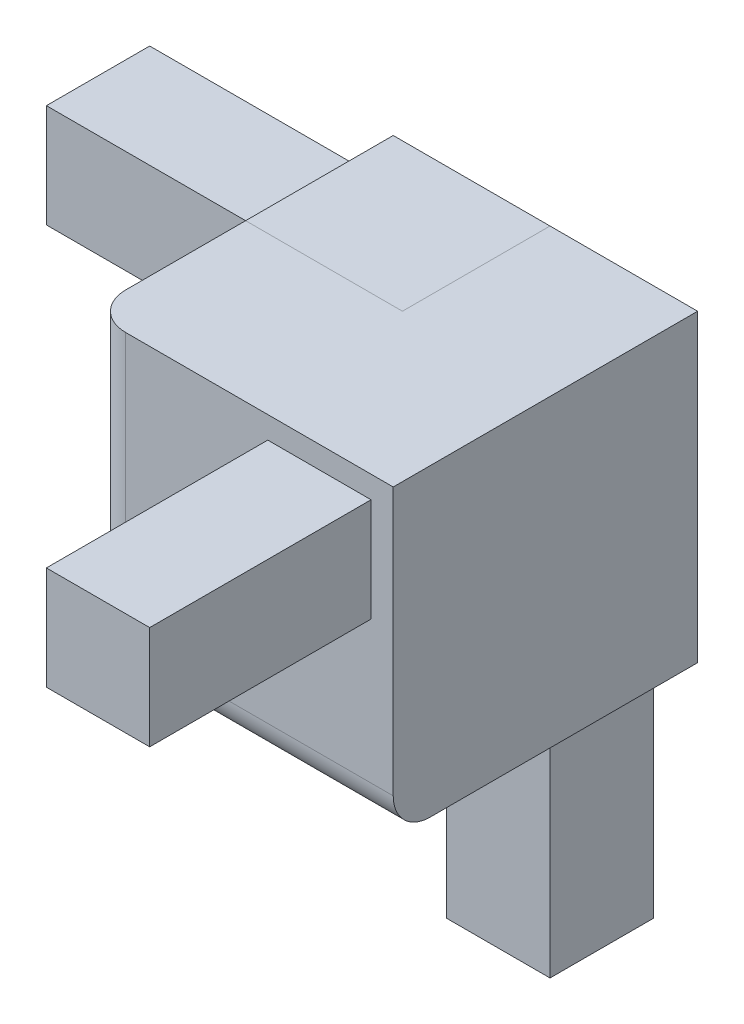
ISO-10303-21;
HEADER;
FILE_DESCRIPTION(('STEP AP214'),'2;1');
FILE_NAME('part.step','',(''),(''),'','','');
FILE_SCHEMA(('AUTOMOTIVE_DESIGN { 1 0 10303 214 1 1 1 1 }'));
ENDSEC;
DATA;
#1=APPLICATION_CONTEXT('core data for automotive mechanical design processes');
#2=APPLICATION_PROTOCOL_DEFINITION('international standard','automotive_design',2000,#1);
#3=PRODUCT_CONTEXT('',#1,'mechanical');
#4=PRODUCT('Part','Part','',(#3));
#5=PRODUCT_RELATED_PRODUCT_CATEGORY('part','',(#4));
#6=PRODUCT_DEFINITION_FORMATION('','',#4);
#7=PRODUCT_DEFINITION_CONTEXT('part definition',#1,'design');
#8=PRODUCT_DEFINITION('design','',#6,#7);
#9=PRODUCT_DEFINITION_SHAPE('','',#8);
#10=(LENGTH_UNIT() NAMED_UNIT(*) SI_UNIT(.MILLI.,.METRE.));
#11=(NAMED_UNIT(*) PLANE_ANGLE_UNIT() SI_UNIT($,.RADIAN.));
#12=(NAMED_UNIT(*) SI_UNIT($,.STERADIAN.) SOLID_ANGLE_UNIT());
#13=UNCERTAINTY_MEASURE_WITH_UNIT(LENGTH_MEASURE(1.E-05),#10,'distance_accuracy_value','');
#14=(GEOMETRIC_REPRESENTATION_CONTEXT(3) GLOBAL_UNCERTAINTY_ASSIGNED_CONTEXT((#13)) GLOBAL_UNIT_ASSIGNED_CONTEXT((#10,
#11,#12)) REPRESENTATION_CONTEXT('',''));
#15=CARTESIAN_POINT('',(0.,0.,0.));
#16=DIRECTION('',(0.,0.,1.));
#17=DIRECTION('',(1.,0.,0.));
#18=AXIS2_PLACEMENT_3D('',#15,#16,#17);
#19=CARTESIAN_POINT('',(19.2615788817127,23.0541991604437,-26.8947253479235));
#20=DIRECTION('',(-1.,0.,0.));
#21=DIRECTION('',(0.,-1.,0.));
#22=AXIS2_PLACEMENT_3D('',#19,#20,#21);
#23=PLANE('',#22);
#24=DIRECTION('',(0.,0.,1.));
#25=VECTOR('',#24,1.);
#26=CARTESIAN_POINT('',(19.2615788817127,35.0541991604437,-26.8947253479235));
#27=LINE('',#26,#25);
#28=CARTESIAN_POINT('',(19.2615788817127,35.0541991604437,-26.8947253479235));
#29=VERTEX_POINT('',#28);
#30=CARTESIAN_POINT('',(19.2615788817127,35.0541991604437,-21.2947253479234));
#31=VERTEX_POINT('',#30);
#32=EDGE_CURVE('E207',#29,#31,#27,.T.);
#33=ORIENTED_EDGE('',*,*,#32,.F.);
#34=DIRECTION('',(0.,1.,0.));
#35=VECTOR('',#34,1.);
#36=CARTESIAN_POINT('',(19.2615788817127,23.0541991604437,-26.8947253479235));
#37=LINE('',#36,#35);
#38=CARTESIAN_POINT('',(19.2615788817127,23.0541991604437,-26.8947253479235));
#39=VERTEX_POINT('',#38);
#40=EDGE_CURVE('E272',#39,#29,#37,.T.);
#41=ORIENTED_EDGE('',*,*,#40,.F.);
#42=DIRECTION('',(0.,0.,1.));
#43=VECTOR('',#42,1.);
#44=CARTESIAN_POINT('',(19.2615788817127,23.0541991604437,-26.8947253479235));
#45=LINE('',#44,#43);
#46=CARTESIAN_POINT('',(19.2615788817127,23.0541991604437,-21.2947253479234));
#47=VERTEX_POINT('',#46);
#48=EDGE_CURVE('E663',#39,#47,#45,.T.);
#49=ORIENTED_EDGE('',*,*,#48,.T.);
#50=DIRECTION('',(0.,1.,0.));
#51=VECTOR('',#50,1.);
#52=CARTESIAN_POINT('',(19.2615788817127,23.0541991604437,-21.2947253479234));
#53=LINE('',#52,#51);
#54=EDGE_CURVE('E676',#47,#31,#53,.T.);
#55=ORIENTED_EDGE('',*,*,#54,.T.);
#56=EDGE_LOOP('',(#33,#41,#49,#55));
#57=FACE_BOUND('',#56,.T.);
#58=ADVANCED_FACE('F39',(#57),#23,.T.);
#59=CARTESIAN_POINT('',(24.8615788817128,23.0541991604437,-26.8947253479235));
#60=DIRECTION('',(0.,0.,-1.));
#61=DIRECTION('',(0.,1.,0.));
#62=AXIS2_PLACEMENT_3D('',#59,#60,#61);
#63=PLANE('',#62);
#64=DIRECTION('',(-1.,0.,0.));
#65=VECTOR('',#64,1.);
#66=CARTESIAN_POINT('',(24.8615788817128,35.0541991604437,-26.8947253479235));
#67=LINE('',#66,#65);
#68=CARTESIAN_POINT('',(24.8615788817128,35.0541991604437,-26.8947253479235));
#69=VERTEX_POINT('',#68);
#70=EDGE_CURVE('E667',#69,#29,#67,.T.);
#71=ORIENTED_EDGE('',*,*,#70,.F.);
#72=DIRECTION('',(0.,1.,0.));
#73=VECTOR('',#72,1.);
#74=CARTESIAN_POINT('',(24.8615788817128,23.0541991604437,-26.8947253479235));
#75=LINE('',#74,#73);
#76=CARTESIAN_POINT('',(24.8615788817128,23.0541991604437,-26.8947253479235));
#77=VERTEX_POINT('',#76);
#78=EDGE_CURVE('E689',#77,#69,#75,.T.);
#79=ORIENTED_EDGE('',*,*,#78,.F.);
#80=DIRECTION('',(-1.,0.,0.));
#81=VECTOR('',#80,1.);
#82=CARTESIAN_POINT('',(24.8615788817128,23.0541991604437,-26.8947253479235));
#83=LINE('',#82,#81);
#84=EDGE_CURVE('E673',#77,#39,#83,.T.);
#85=ORIENTED_EDGE('',*,*,#84,.T.);
#86=ORIENTED_EDGE('',*,*,#40,.T.);
#87=EDGE_LOOP('',(#71,#79,#85,#86));
#88=FACE_BOUND('',#87,.T.);
#89=ADVANCED_FACE('F383',(#88),#63,.T.);
#90=CARTESIAN_POINT('',(24.8615788817128,23.0541991604437,-21.2947253479234));
#91=DIRECTION('',(1.,0.,0.));
#92=DIRECTION('',(0.,0.,-1.));
#93=AXIS2_PLACEMENT_3D('',#90,#91,#92);
#94=PLANE('',#93);
#95=DIRECTION('',(0.,0.,-1.));
#96=VECTOR('',#95,1.);
#97=CARTESIAN_POINT('',(24.8615788817128,35.0541991604437,-21.2947253479234));
#98=LINE('',#97,#96);
#99=CARTESIAN_POINT('',(24.8615788817128,35.0541991604437,-21.2947253479234));
#100=VERTEX_POINT('',#99);
#101=EDGE_CURVE('E682',#100,#69,#98,.T.);
#102=ORIENTED_EDGE('',*,*,#101,.F.);
#103=DIRECTION('',(0.,1.,0.));
#104=VECTOR('',#103,1.);
#105=CARTESIAN_POINT('',(24.8615788817128,23.0541991604437,-21.2947253479234));
#106=LINE('',#105,#104);
#107=CARTESIAN_POINT('',(24.8615788817128,23.0541991604437,-21.2947253479234));
#108=VERTEX_POINT('',#107);
#109=EDGE_CURVE('E691',#108,#100,#106,.T.);
#110=ORIENTED_EDGE('',*,*,#109,.F.);
#111=DIRECTION('',(0.,0.,-1.));
#112=VECTOR('',#111,1.);
#113=CARTESIAN_POINT('',(24.8615788817128,23.0541991604437,-21.2947253479234));
#114=LINE('',#113,#112);
#115=EDGE_CURVE('E670',#108,#77,#114,.T.);
#116=ORIENTED_EDGE('',*,*,#115,.T.);
#117=ORIENTED_EDGE('',*,*,#78,.T.);
#118=EDGE_LOOP('',(#102,#110,#116,#117));
#119=FACE_BOUND('',#118,.T.);
#120=ADVANCED_FACE('F386',(#119),#94,.T.);
#121=CARTESIAN_POINT('',(19.2615788817127,23.0541991604437,-21.2947253479234));
#122=DIRECTION('',(0.,0.,1.));
#123=DIRECTION('',(0.,-1.,0.));
#124=AXIS2_PLACEMENT_3D('',#121,#122,#123);
#125=PLANE('',#124);
#126=DIRECTION('',(1.,0.,0.));
#127=VECTOR('',#126,1.);
#128=CARTESIAN_POINT('',(19.2615788817127,35.0541991604437,-21.2947253479234));
#129=LINE('',#128,#127);
#130=EDGE_CURVE('E679',#31,#100,#129,.T.);
#131=ORIENTED_EDGE('',*,*,#130,.F.);
#132=ORIENTED_EDGE('',*,*,#54,.F.);
#133=DIRECTION('',(1.,0.,0.));
#134=VECTOR('',#133,1.);
#135=CARTESIAN_POINT('',(19.2615788817127,23.0541991604437,-21.2947253479234));
#136=LINE('',#135,#134);
#137=EDGE_CURVE('E666',#47,#108,#136,.T.);
#138=ORIENTED_EDGE('',*,*,#137,.T.);
#139=ORIENTED_EDGE('',*,*,#109,.T.);
#140=EDGE_LOOP('',(#131,#132,#138,#139));
#141=FACE_BOUND('',#140,.T.);
#142=ADVANCED_FACE('F381',(#141),#125,.T.);
#143=CARTESIAN_POINT('',(0.,23.0541991604437,0.));
#144=DIRECTION('',(0.,1.,0.));
#145=DIRECTION('',(0.,0.,1.));
#146=AXIS2_PLACEMENT_3D('',#143,#144,#145);
#147=PLANE('',#146);
#148=ORIENTED_EDGE('',*,*,#48,.F.);
#149=ORIENTED_EDGE('',*,*,#84,.F.);
#150=ORIENTED_EDGE('',*,*,#115,.F.);
#151=ORIENTED_EDGE('',*,*,#137,.F.);
#152=EDGE_LOOP('',(#148,#149,#150,#151));
#153=FACE_BOUND('',#152,.T.);
#154=ADVANCED_FACE('F372',(#153),#147,.F.);
#155=CARTESIAN_POINT('',(0.,35.0541991604437,0.));
#156=DIRECTION('',(0.,-1.,0.));
#157=DIRECTION('',(0.,0.,-1.));
#158=AXIS2_PLACEMENT_3D('',#155,#156,#157);
#159=PLANE('',#158);
#160=DIRECTION('',(1.,0.,0.));
#161=VECTOR('',#160,1.);
#162=CARTESIAN_POINT('',(9.56157888171276,35.0541991604437,-13.5947253479234));
#163=LINE('',#162,#161);
#164=CARTESIAN_POINT('',(26.0615788817128,35.0541991604437,-13.5947253479234));
#165=VERTEX_POINT('',#164);
#166=CARTESIAN_POINT('',(11.5615788817127,35.0541991604437,-13.5947253479234));
#167=VERTEX_POINT('',#166);
#168=EDGE_CURVE('E56',#165,#167,#163,.F.);
#169=ORIENTED_EDGE('',*,*,#168,.T.);
#170=DIRECTION('',(0.,0.,1.));
#171=VECTOR('',#170,1.);
#172=CARTESIAN_POINT('',(11.5615788817127,35.0541991604437,0.));
#173=LINE('',#172,#171);
#174=CARTESIAN_POINT('',(11.5615788817127,35.0541991604437,-28.0947379627985));
#175=VERTEX_POINT('',#174);
#176=EDGE_CURVE('E60',#167,#175,#173,.F.);
#177=ORIENTED_EDGE('',*,*,#176,.T.);
#178=DIRECTION('',(-1.,0.,0.));
#179=VECTOR('',#178,1.);
#180=CARTESIAN_POINT('',(26.0615788817128,35.0541991604437,-28.0947379627985));
#181=LINE('',#180,#179);
#182=CARTESIAN_POINT('',(18.0615788817128,35.0541991604437,-28.0947379572807));
#183=VERTEX_POINT('',#182);
#184=EDGE_CURVE('E217',#183,#175,#181,.T.);
#185=ORIENTED_EDGE('',*,*,#184,.F.);
#186=DIRECTION('',(-1.,0.,0.));
#187=VECTOR('',#186,1.);
#188=CARTESIAN_POINT('',(26.0615788817128,35.0541991604437,-28.0947379572807));
#189=LINE('',#188,#187);
#190=CARTESIAN_POINT('',(26.0615788817128,35.0541991604437,-28.0947379572807));
#191=VERTEX_POINT('',#190);
#192=EDGE_CURVE('E414',#191,#183,#189,.T.);
#193=ORIENTED_EDGE('',*,*,#192,.F.);
#194=DIRECTION('',(0.,0.,-1.));
#195=VECTOR('',#194,1.);
#196=CARTESIAN_POINT('',(26.0615788817128,35.0541991604437,-28.0947379572807));
#197=LINE('',#196,#195);
#198=EDGE_CURVE('E335',#165,#191,#197,.T.);
#199=ORIENTED_EDGE('',*,*,#198,.F.);
#200=EDGE_LOOP('',(#169,#177,#185,#193,#199));
#201=FACE_BOUND('',#200,.T.);
#202=ORIENTED_EDGE('',*,*,#70,.T.);
#203=ORIENTED_EDGE('',*,*,#32,.T.);
#204=ORIENTED_EDGE('',*,*,#130,.T.);
#205=ORIENTED_EDGE('',*,*,#101,.T.);
#206=EDGE_LOOP('',(#202,#203,#204,#205));
#207=FACE_BOUND('',#206,.T.);
#208=ADVANCED_FACE('F369',(#201,#207),#159,.T.);
#209=CARTESIAN_POINT('',(26.0615788817128,62.8679076594284,-28.0947379572807));
#210=DIRECTION('',(0.,0.,1.));
#211=DIRECTION('',(1.,0.,0.));
#212=AXIS2_PLACEMENT_3D('',#209,#210,#211);
#213=PLANE('',#212);
#214=DIRECTION('',(0.,-0.999999999999708,-7.64537882137411E-07));
#215=VECTOR('',#214,1.);
#216=CARTESIAN_POINT('',(18.0615788817128,62.8679076594122,-28.0947166981647));
#217=LINE('',#216,#215);
#218=CARTESIAN_POINT('',(18.0615788817128,35.0614163657298,-28.0947379572807));
#219=VERTEX_POINT('',#218);
#220=EDGE_CURVE('E214',#219,#183,#217,.T.);
#221=ORIENTED_EDGE('',*,*,#220,.F.);
#222=DIRECTION('',(0.,-1.,0.));
#223=VECTOR('',#222,1.);
#224=CARTESIAN_POINT('',(18.0615788817128,62.8679076594284,-28.0947379572807));
#225=LINE('',#224,#223);
#226=CARTESIAN_POINT('',(18.0615788817128,43.5542052767421,-28.0947314642219));
#227=VERTEX_POINT('',#226);
#228=EDGE_CURVE('E415',#227,#219,#225,.T.);
#229=ORIENTED_EDGE('',*,*,#228,.F.);
#230=CARTESIAN_POINT('',(18.0615788817128,51.554199160434,-28.0947253479235));
#231=DIRECTION('',(0.,-0.999999999999708,-7.64537882137861E-07));
#232=VECTOR('',#231,1.);
#233=LINE('',#230,#232);
#234=CARTESIAN_POINT('',(18.0615788817128,51.5541991604437,-28.0947316526021));
#235=VERTEX_POINT('',#234);
#236=EDGE_CURVE('E330',#235,#227,#233,.T.);
#237=ORIENTED_EDGE('',*,*,#236,.F.);
#238=DIRECTION('',(1.,0.,0.));
#239=VECTOR('',#238,1.);
#240=CARTESIAN_POINT('',(26.0615788817128,51.5541991604437,-28.0947379572807));
#241=LINE('',#240,#239);
#242=CARTESIAN_POINT('',(26.0615788817128,51.5541991604437,-28.0947379572807));
#243=VERTEX_POINT('',#242);
#244=EDGE_CURVE('E270',#235,#243,#241,.T.);
#245=ORIENTED_EDGE('',*,*,#244,.T.);
#246=DIRECTION('',(0.,-1.,0.));
#247=VECTOR('',#246,1.);
#248=CARTESIAN_POINT('',(26.0615788817128,62.8679076594284,-28.0947379572807));
#249=LINE('',#248,#247);
#250=EDGE_CURVE('E206',#243,#191,#249,.T.);
#251=ORIENTED_EDGE('',*,*,#250,.T.);
#252=ORIENTED_EDGE('',*,*,#192,.T.);
#253=EDGE_LOOP('',(#221,#229,#237,#245,#251,#252));
#254=FACE_BOUND('',#253,.T.);
#255=ADVANCED_FACE('F371',(#254),#213,.F.);
#256=CARTESIAN_POINT('',(26.0615788817128,62.8679076594284,-28.0947379572807));
#257=DIRECTION('',(-1.,0.,0.));
#258=DIRECTION('',(0.,0.,1.));
#259=AXIS2_PLACEMENT_3D('',#256,#257,#258);
#260=PLANE('',#259);
#261=DIRECTION('',(0.,-1.,0.));
#262=VECTOR('',#261,1.);
#263=CARTESIAN_POINT('',(26.0615788817128,51.5541991604437,-11.5947253479234));
#264=LINE('',#263,#262);
#265=CARTESIAN_POINT('',(26.0615788817128,51.5541991604437,-11.5947253479234));
#266=VERTEX_POINT('',#265);
#267=CARTESIAN_POINT('',(26.0615788817128,37.0541991604437,-11.5947253479234));
#268=VERTEX_POINT('',#267);
#269=EDGE_CURVE('E199',#266,#268,#264,.T.);
#270=ORIENTED_EDGE('',*,*,#269,.T.);
#271=CARTESIAN_POINT('',(26.0615788817128,37.0541991604437,-13.5947253479234));
#272=DIRECTION('',(-1.,0.,0.));
#273=DIRECTION('',(0.,0.,1.));
#274=AXIS2_PLACEMENT_3D('',#271,#272,#273);
#275=CIRCLE('',#274,2.);
#276=EDGE_CURVE('E11',#268,#165,#275,.F.);
#277=ORIENTED_EDGE('',*,*,#276,.T.);
#278=ORIENTED_EDGE('',*,*,#198,.T.);
#279=ORIENTED_EDGE('',*,*,#250,.F.);
#280=DIRECTION('',(0.,0.,1.));
#281=VECTOR('',#280,1.);
#282=CARTESIAN_POINT('',(26.0615788817128,51.5541991604437,-28.0947379572807));
#283=LINE('',#282,#281);
#284=EDGE_CURVE('E190',#243,#266,#283,.T.);
#285=ORIENTED_EDGE('',*,*,#284,.T.);
#286=EDGE_LOOP('',(#270,#277,#278,#279,#285));
#287=FACE_BOUND('',#286,.T.);
#288=ADVANCED_FACE('F203',(#287),#260,.F.);
#289=CARTESIAN_POINT('',(26.0615788817128,51.5541991604437,-39.4084338469083));
#290=DIRECTION('',(0.,-1.,0.));
#291=DIRECTION('',(0.,0.,-1.));
#292=AXIS2_PLACEMENT_3D('',#289,#290,#291);
#293=PLANE('',#292);
#294=DIRECTION('',(0.,0.,1.));
#295=VECTOR('',#294,1.);
#296=CARTESIAN_POINT('',(9.56157888171276,51.5541991604437,-51.4292554345205));
#297=LINE('',#296,#295);
#298=CARTESIAN_POINT('',(9.56157888171274,51.5541930441453,-20.0947314642218));
#299=VERTEX_POINT('',#298);
#300=CARTESIAN_POINT('',(9.56157888171276,51.5541991604437,-13.5947253479234));
#301=VERTEX_POINT('',#300);
#302=EDGE_CURVE('E293',#299,#301,#297,.T.);
#303=ORIENTED_EDGE('',*,*,#302,.T.);
#304=CARTESIAN_POINT('',(11.5615788817127,51.5541991604437,-13.5947253479234));
#305=DIRECTION('',(0.,-1.,0.));
#306=DIRECTION('',(0.,0.,-1.));
#307=AXIS2_PLACEMENT_3D('',#304,#305,#306);
#308=CIRCLE('',#307,2.);
#309=CARTESIAN_POINT('',(11.5615788817127,51.5541991604437,-11.5947253479234));
#310=VERTEX_POINT('',#309);
#311=EDGE_CURVE('E193',#301,#310,#308,.F.);
#312=ORIENTED_EDGE('',*,*,#311,.T.);
#313=DIRECTION('',(1.,0.,0.));
#314=VECTOR('',#313,1.);
#315=CARTESIAN_POINT('',(26.0615788817128,51.5541991604437,-11.5947253479234));
#316=LINE('',#315,#314);
#317=EDGE_CURVE('E186',#310,#266,#316,.T.);
#318=ORIENTED_EDGE('',*,*,#317,.T.);
#319=ORIENTED_EDGE('',*,*,#284,.F.);
#320=ORIENTED_EDGE('',*,*,#244,.F.);
#321=DIRECTION('',(0.,0.,-1.));
#322=VECTOR('',#321,1.);
#323=CARTESIAN_POINT('',(18.0615788817128,51.5541991604437,-28.0947379572807));
#324=LINE('',#323,#322);
#325=CARTESIAN_POINT('',(18.0615788817128,51.5541991604437,-20.0947379572807));
#326=VERTEX_POINT('',#325);
#327=EDGE_CURVE('E208',#326,#235,#324,.T.);
#328=ORIENTED_EDGE('',*,*,#327,.F.);
#329=DIRECTION('',(-1.,0.,0.));
#330=VECTOR('',#329,1.);
#331=CARTESIAN_POINT('',(37.3752873806976,51.5541930441453,-20.0947314642218));
#332=LINE('',#331,#330);
#333=EDGE_CURVE('E256',#326,#299,#332,.T.);
#334=ORIENTED_EDGE('',*,*,#333,.T.);
#335=EDGE_LOOP('',(#303,#312,#318,#319,#320,#328,#334));
#336=FACE_BOUND('',#335,.T.);
#337=ADVANCED_FACE('F189',(#336),#293,.F.);
#338=CARTESIAN_POINT('',(37.3752873806976,51.5541991604437,-28.0947253479235));
#339=DIRECTION('',(0.,-0.999999999999708,-7.6453788170373E-07));
#340=DIRECTION('',(0.,7.6453788170373E-07,-0.999999999999708));
#341=AXIS2_PLACEMENT_3D('',#338,#339,#340);
#342=PLANE('',#341);
#343=ORIENTED_EDGE('',*,*,#333,.F.);
#344=ORIENTED_EDGE('',*,*,#327,.T.);
#345=DIRECTION('',(-1.,0.,0.));
#346=VECTOR('',#345,1.);
#347=CARTESIAN_POINT('',(37.3752873806976,51.5541991604437,-28.0947253479235));
#348=LINE('',#347,#346);
#349=CARTESIAN_POINT('',(9.56157888171274,51.5541991604437,-28.0947253479235));
#350=VERTEX_POINT('',#349);
#351=EDGE_CURVE('E265',#235,#350,#348,.T.);
#352=ORIENTED_EDGE('',*,*,#351,.T.);
#353=DIRECTION('',(0.,-7.6453788170373E-07,0.999999999999708));
#354=VECTOR('',#353,1.);
#355=CARTESIAN_POINT('',(9.56157888171274,51.5541991604437,-28.0947253479235));
#356=LINE('',#355,#354);
#357=EDGE_CURVE('E254',#350,#299,#356,.T.);
#358=ORIENTED_EDGE('',*,*,#357,.T.);
#359=EDGE_LOOP('',(#343,#344,#352,#358));
#360=FACE_BOUND('',#359,.T.);
#361=ADVANCED_FACE('F318',(#360),#342,.F.);
#362=CARTESIAN_POINT('',(37.3752873806976,51.5541991604437,-28.0947253479235));
#363=DIRECTION('',(0.,-7.64537882137411E-07,0.999999999999708));
#364=DIRECTION('',(0.,-0.999999999999708,-7.64537882137411E-07));
#365=AXIS2_PLACEMENT_3D('',#362,#363,#364);
#366=PLANE('',#365);
#367=ORIENTED_EDGE('',*,*,#184,.T.);
#368=CARTESIAN_POINT('',(11.5615788817127,37.0541991604437,-28.0947364337228));
#369=DIRECTION('',(0.,-7.64537882137411E-07,0.999999999999708));
#370=DIRECTION('',(0.,-0.999999999999708,-7.64537882137411E-07));
#371=AXIS2_PLACEMENT_3D('',#368,#369,#370);
#372=CIRCLE('',#371,2.);
#373=CARTESIAN_POINT('',(9.56157888171272,37.0541991604437,-28.0947364337228));
#374=VERTEX_POINT('',#373);
#375=EDGE_CURVE('E48',#175,#374,#372,.F.);
#376=ORIENTED_EDGE('',*,*,#375,.T.);
#377=DIRECTION('',(0.,0.999999999999708,7.64537882137411E-07));
#378=VECTOR('',#377,1.);
#379=CARTESIAN_POINT('',(9.56157888171274,51.5541991604437,-28.0947253479235));
#380=LINE('',#379,#378);
#381=EDGE_CURVE('E247',#374,#350,#380,.T.);
#382=ORIENTED_EDGE('',*,*,#381,.T.);
#383=ORIENTED_EDGE('',*,*,#351,.F.);
#384=ORIENTED_EDGE('',*,*,#236,.T.);
#385=ORIENTED_EDGE('',*,*,#228,.T.);
#386=ORIENTED_EDGE('',*,*,#220,.T.);
#387=EDGE_LOOP('',(#367,#376,#382,#383,#384,#385,#386));
#388=FACE_BOUND('',#387,.T.);
#389=ADVANCED_FACE('F300',(#388),#366,.F.);
#390=CARTESIAN_POINT('',(-2.43842111828727,44.7541991604437,-21.2947253479234));
#391=DIRECTION('',(0.,-1.,0.));
#392=DIRECTION('',(1.,0.,0.));
#393=AXIS2_PLACEMENT_3D('',#390,#391,#392);
#394=PLANE('',#393);
#395=DIRECTION('',(0.,0.,-1.));
#396=VECTOR('',#395,1.);
#397=CARTESIAN_POINT('',(9.56157888171273,44.7541991604437,-21.2947253479234));
#398=LINE('',#397,#396);
#399=CARTESIAN_POINT('',(9.56157888171273,44.7541991604437,-21.2947253479234));
#400=VERTEX_POINT('',#399);
#401=CARTESIAN_POINT('',(9.56157888171273,44.7541991604437,-26.8947253479234));
#402=VERTEX_POINT('',#401);
#403=EDGE_CURVE('E319',#400,#402,#398,.T.);
#404=ORIENTED_EDGE('',*,*,#403,.F.);
#405=DIRECTION('',(1.,0.,0.));
#406=VECTOR('',#405,1.);
#407=CARTESIAN_POINT('',(-2.43842111828727,44.7541991604437,-21.2947253479234));
#408=LINE('',#407,#406);
#409=CARTESIAN_POINT('',(-2.43842111828727,44.7541991604437,-21.2947253479234));
#410=VERTEX_POINT('',#409);
#411=EDGE_CURVE('E416',#410,#400,#408,.T.);
#412=ORIENTED_EDGE('',*,*,#411,.F.);
#413=DIRECTION('',(0.,0.,-1.));
#414=VECTOR('',#413,1.);
#415=CARTESIAN_POINT('',(-2.43842111828727,44.7541991604437,-21.2947253479234));
#416=LINE('',#415,#414);
#417=CARTESIAN_POINT('',(-2.43842111828727,44.7541991604437,-26.8947253479234));
#418=VERTEX_POINT('',#417);
#419=EDGE_CURVE('E444',#410,#418,#416,.T.);
#420=ORIENTED_EDGE('',*,*,#419,.T.);
#421=DIRECTION('',(1.,0.,0.));
#422=VECTOR('',#421,1.);
#423=CARTESIAN_POINT('',(-2.43842111828727,44.7541991604437,-26.8947253479234));
#424=LINE('',#423,#422);
#425=EDGE_CURVE('E326',#418,#402,#424,.T.);
#426=ORIENTED_EDGE('',*,*,#425,.T.);
#427=EDGE_LOOP('',(#404,#412,#420,#426));
#428=FACE_BOUND('',#427,.T.);
#429=ADVANCED_FACE('F346',(#428),#394,.T.);
#430=CARTESIAN_POINT('',(-2.43842111828726,50.3541991604437,-21.2947253479234));
#431=DIRECTION('',(0.,0.,1.));
#432=DIRECTION('',(1.,0.,0.));
#433=AXIS2_PLACEMENT_3D('',#430,#431,#432);
#434=PLANE('',#433);
#435=DIRECTION('',(0.,-1.,0.));
#436=VECTOR('',#435,1.);
#437=CARTESIAN_POINT('',(9.56157888171274,50.3541991604437,-21.2947253479234));
#438=LINE('',#437,#436);
#439=CARTESIAN_POINT('',(9.56157888171274,50.3541991604437,-21.2947253479234));
#440=VERTEX_POINT('',#439);
#441=EDGE_CURVE('E426',#440,#400,#438,.T.);
#442=ORIENTED_EDGE('',*,*,#441,.F.);
#443=DIRECTION('',(1.,0.,0.));
#444=VECTOR('',#443,1.);
#445=CARTESIAN_POINT('',(-2.43842111828726,50.3541991604437,-21.2947253479234));
#446=LINE('',#445,#444);
#447=CARTESIAN_POINT('',(-2.43842111828726,50.3541991604437,-21.2947253479234));
#448=VERTEX_POINT('',#447);
#449=EDGE_CURVE('E418',#448,#440,#446,.T.);
#450=ORIENTED_EDGE('',*,*,#449,.F.);
#451=DIRECTION('',(0.,-1.,0.));
#452=VECTOR('',#451,1.);
#453=CARTESIAN_POINT('',(-2.43842111828726,50.3541991604437,-21.2947253479234));
#454=LINE('',#453,#452);
#455=EDGE_CURVE('E431',#448,#410,#454,.T.);
#456=ORIENTED_EDGE('',*,*,#455,.T.);
#457=ORIENTED_EDGE('',*,*,#411,.T.);
#458=EDGE_LOOP('',(#442,#450,#456,#457));
#459=FACE_BOUND('',#458,.T.);
#460=ADVANCED_FACE('F353',(#459),#434,.T.);
#461=CARTESIAN_POINT('',(-2.43842111828726,50.3541991604437,-26.8947253479234));
#462=DIRECTION('',(0.,1.,0.));
#463=DIRECTION('',(-1.,0.,0.));
#464=AXIS2_PLACEMENT_3D('',#461,#462,#463);
#465=PLANE('',#464);
#466=DIRECTION('',(0.,0.,1.));
#467=VECTOR('',#466,1.);
#468=CARTESIAN_POINT('',(9.56157888171274,50.3541991604437,-26.8947253479234));
#469=LINE('',#468,#467);
#470=CARTESIAN_POINT('',(9.56157888171274,50.3541991604437,-26.8947253479234));
#471=VERTEX_POINT('',#470);
#472=EDGE_CURVE('E442',#471,#440,#469,.T.);
#473=ORIENTED_EDGE('',*,*,#472,.F.);
#474=DIRECTION('',(1.,0.,0.));
#475=VECTOR('',#474,1.);
#476=CARTESIAN_POINT('',(-2.43842111828726,50.3541991604437,-26.8947253479234));
#477=LINE('',#476,#475);
#478=CARTESIAN_POINT('',(-2.43842111828726,50.3541991604437,-26.8947253479234));
#479=VERTEX_POINT('',#478);
#480=EDGE_CURVE('E423',#479,#471,#477,.T.);
#481=ORIENTED_EDGE('',*,*,#480,.F.);
#482=DIRECTION('',(0.,0.,1.));
#483=VECTOR('',#482,1.);
#484=CARTESIAN_POINT('',(-2.43842111828726,50.3541991604437,-26.8947253479234));
#485=LINE('',#484,#483);
#486=EDGE_CURVE('E433',#479,#448,#485,.T.);
#487=ORIENTED_EDGE('',*,*,#486,.T.);
#488=ORIENTED_EDGE('',*,*,#449,.T.);
#489=EDGE_LOOP('',(#473,#481,#487,#488));
#490=FACE_BOUND('',#489,.T.);
#491=ADVANCED_FACE('F356',(#490),#465,.T.);
#492=CARTESIAN_POINT('',(-2.43842111828727,44.7541991604437,-26.8947253479234));
#493=DIRECTION('',(0.,0.,-1.));
#494=DIRECTION('',(0.,1.,0.));
#495=AXIS2_PLACEMENT_3D('',#492,#493,#494);
#496=PLANE('',#495);
#497=DIRECTION('',(0.,1.,0.));
#498=VECTOR('',#497,1.);
#499=CARTESIAN_POINT('',(9.56157888171273,44.7541991604437,-26.8947253479234));
#500=LINE('',#499,#498);
#501=EDGE_CURVE('E322',#402,#471,#500,.T.);
#502=ORIENTED_EDGE('',*,*,#501,.F.);
#503=ORIENTED_EDGE('',*,*,#425,.F.);
#504=DIRECTION('',(0.,1.,0.));
#505=VECTOR('',#504,1.);
#506=CARTESIAN_POINT('',(-2.43842111828727,44.7541991604437,-26.8947253479234));
#507=LINE('',#506,#505);
#508=EDGE_CURVE('E437',#418,#479,#507,.T.);
#509=ORIENTED_EDGE('',*,*,#508,.T.);
#510=ORIENTED_EDGE('',*,*,#480,.T.);
#511=EDGE_LOOP('',(#502,#503,#509,#510));
#512=FACE_BOUND('',#511,.T.);
#513=ADVANCED_FACE('F351',(#512),#496,.T.);
#514=CARTESIAN_POINT('',(-2.43842111828734,0.,0.));
#515=DIRECTION('',(1.,0.,0.));
#516=DIRECTION('',(0.,1.,0.));
#517=AXIS2_PLACEMENT_3D('',#514,#515,#516);
#518=PLANE('',#517);
#519=ORIENTED_EDGE('',*,*,#419,.F.);
#520=ORIENTED_EDGE('',*,*,#455,.F.);
#521=ORIENTED_EDGE('',*,*,#486,.F.);
#522=ORIENTED_EDGE('',*,*,#508,.F.);
#523=EDGE_LOOP('',(#519,#520,#521,#522));
#524=FACE_BOUND('',#523,.T.);
#525=ADVANCED_FACE('F348',(#524),#518,.F.);
#526=CARTESIAN_POINT('',(9.56157888171266,0.,0.));
#527=DIRECTION('',(-1.,0.,0.));
#528=DIRECTION('',(0.,-1.,0.));
#529=AXIS2_PLACEMENT_3D('',#526,#527,#528);
#530=PLANE('',#529);
#531=DIRECTION('',(0.,0.,1.));
#532=VECTOR('',#531,1.);
#533=CARTESIAN_POINT('',(9.56157888171272,37.0541991604437,0.));
#534=LINE('',#533,#532);
#535=CARTESIAN_POINT('',(9.56157888171272,37.0541991604437,-13.5947253479234));
#536=VERTEX_POINT('',#535);
#537=EDGE_CURVE('E278',#374,#536,#534,.T.);
#538=ORIENTED_EDGE('',*,*,#537,.T.);
#539=DIRECTION('',(0.,-1.,0.));
#540=VECTOR('',#539,1.);
#541=CARTESIAN_POINT('',(9.56157888171274,51.5541991604437,-13.5947253479234));
#542=LINE('',#541,#540);
#543=EDGE_CURVE('E280',#536,#301,#542,.F.);
#544=ORIENTED_EDGE('',*,*,#543,.T.);
#545=ORIENTED_EDGE('',*,*,#302,.F.);
#546=ORIENTED_EDGE('',*,*,#357,.F.);
#547=ORIENTED_EDGE('',*,*,#381,.F.);
#548=EDGE_LOOP('',(#538,#544,#545,#546,#547));
#549=FACE_BOUND('',#548,.T.);
#550=ORIENTED_EDGE('',*,*,#441,.T.);
#551=ORIENTED_EDGE('',*,*,#403,.T.);
#552=ORIENTED_EDGE('',*,*,#501,.T.);
#553=ORIENTED_EDGE('',*,*,#472,.T.);
#554=EDGE_LOOP('',(#550,#551,#552,#553));
#555=FACE_BOUND('',#554,.T.);
#556=ADVANCED_FACE('F309',(#549,#555),#530,.T.);
#557=CARTESIAN_POINT('',(19.2615788817127,50.3541991604437,0.40527465207656));
#558=DIRECTION('',(0.,1.,0.));
#559=DIRECTION('',(-1.,0.,0.));
#560=AXIS2_PLACEMENT_3D('',#557,#558,#559);
#561=PLANE('',#560);
#562=DIRECTION('',(1.,0.,0.));
#563=VECTOR('',#562,1.);
#564=CARTESIAN_POINT('',(19.2615788817127,50.3541991604437,-11.5947253479234));
#565=LINE('',#564,#563);
#566=CARTESIAN_POINT('',(19.2615788817127,50.3541991604437,-11.5947253479234));
#567=VERTEX_POINT('',#566);
#568=CARTESIAN_POINT('',(24.8615788817128,50.3541991604437,-11.5947253479234));
#569=VERTEX_POINT('',#568);
#570=EDGE_CURVE('E198',#567,#569,#565,.T.);
#571=ORIENTED_EDGE('',*,*,#570,.F.);
#572=DIRECTION('',(0.,0.,-1.));
#573=VECTOR('',#572,1.);
#574=CARTESIAN_POINT('',(19.2615788817127,50.3541991604437,0.40527465207656));
#575=LINE('',#574,#573);
#576=CARTESIAN_POINT('',(19.2615788817127,50.3541991604437,0.40527465207656));
#577=VERTEX_POINT('',#576);
#578=EDGE_CURVE('E244',#577,#567,#575,.T.);
#579=ORIENTED_EDGE('',*,*,#578,.F.);
#580=DIRECTION('',(1.,0.,0.));
#581=VECTOR('',#580,1.);
#582=CARTESIAN_POINT('',(19.2615788817127,50.3541991604437,0.40527465207656));
#583=LINE('',#582,#581);
#584=CARTESIAN_POINT('',(24.8615788817128,50.3541991604437,0.40527465207656));
#585=VERTEX_POINT('',#584);
#586=EDGE_CURVE('E220',#577,#585,#583,.T.);
#587=ORIENTED_EDGE('',*,*,#586,.T.);
#588=DIRECTION('',(0.,0.,-1.));
#589=VECTOR('',#588,1.);
#590=CARTESIAN_POINT('',(24.8615788817128,50.3541991604437,0.40527465207656));
#591=LINE('',#590,#589);
#592=EDGE_CURVE('E233',#585,#569,#591,.T.);
#593=ORIENTED_EDGE('',*,*,#592,.T.);
#594=EDGE_LOOP('',(#571,#579,#587,#593));
#595=FACE_BOUND('',#594,.T.);
#596=ADVANCED_FACE('F449',(#595),#561,.T.);
#597=CARTESIAN_POINT('',(19.2615788817127,44.7541991604437,0.40527465207656));
#598=DIRECTION('',(-1.,0.,0.));
#599=DIRECTION('',(0.,0.,1.));
#600=AXIS2_PLACEMENT_3D('',#597,#598,#599);
#601=PLANE('',#600);
#602=DIRECTION('',(0.,1.,0.));
#603=VECTOR('',#602,1.);
#604=CARTESIAN_POINT('',(19.2615788817127,44.7541991604437,-11.5947253479234));
#605=LINE('',#604,#603);
#606=CARTESIAN_POINT('',(19.2615788817127,44.7541991604437,-11.5947253479234));
#607=VERTEX_POINT('',#606);
#608=EDGE_CURVE('E224',#607,#567,#605,.T.);
#609=ORIENTED_EDGE('',*,*,#608,.F.);
#610=DIRECTION('',(0.,0.,-1.));
#611=VECTOR('',#610,1.);
#612=CARTESIAN_POINT('',(19.2615788817127,44.7541991604437,0.40527465207656));
#613=LINE('',#612,#611);
#614=CARTESIAN_POINT('',(19.2615788817127,44.7541991604437,0.40527465207656));
#615=VERTEX_POINT('',#614);
#616=EDGE_CURVE('E248',#615,#607,#613,.T.);
#617=ORIENTED_EDGE('',*,*,#616,.F.);
#618=DIRECTION('',(0.,1.,0.));
#619=VECTOR('',#618,1.);
#620=CARTESIAN_POINT('',(19.2615788817127,44.7541991604437,0.40527465207656));
#621=LINE('',#620,#619);
#622=EDGE_CURVE('E230',#615,#577,#621,.T.);
#623=ORIENTED_EDGE('',*,*,#622,.T.);
#624=ORIENTED_EDGE('',*,*,#578,.T.);
#625=EDGE_LOOP('',(#609,#617,#623,#624));
#626=FACE_BOUND('',#625,.T.);
#627=ADVANCED_FACE('F453',(#626),#601,.T.);
#628=CARTESIAN_POINT('',(24.8615788817128,44.7541991604437,0.40527465207656));
#629=DIRECTION('',(0.,-1.,0.));
#630=DIRECTION('',(1.,0.,0.));
#631=AXIS2_PLACEMENT_3D('',#628,#629,#630);
#632=PLANE('',#631);
#633=DIRECTION('',(-1.,0.,0.));
#634=VECTOR('',#633,1.);
#635=CARTESIAN_POINT('',(24.8615788817128,44.7541991604437,-11.5947253479234));
#636=LINE('',#635,#634);
#637=CARTESIAN_POINT('',(24.8615788817128,44.7541991604437,-11.5947253479234));
#638=VERTEX_POINT('',#637);
#639=EDGE_CURVE('E239',#638,#607,#636,.T.);
#640=ORIENTED_EDGE('',*,*,#639,.F.);
#641=DIRECTION('',(0.,0.,-1.));
#642=VECTOR('',#641,1.);
#643=CARTESIAN_POINT('',(24.8615788817128,44.7541991604437,0.40527465207656));
#644=LINE('',#643,#642);
#645=CARTESIAN_POINT('',(24.8615788817128,44.7541991604437,0.40527465207656));
#646=VERTEX_POINT('',#645);
#647=EDGE_CURVE('E250',#646,#638,#644,.T.);
#648=ORIENTED_EDGE('',*,*,#647,.F.);
#649=DIRECTION('',(-1.,0.,0.));
#650=VECTOR('',#649,1.);
#651=CARTESIAN_POINT('',(24.8615788817128,44.7541991604437,0.40527465207656));
#652=LINE('',#651,#650);
#653=EDGE_CURVE('E227',#646,#615,#652,.T.);
#654=ORIENTED_EDGE('',*,*,#653,.T.);
#655=ORIENTED_EDGE('',*,*,#616,.T.);
#656=EDGE_LOOP('',(#640,#648,#654,#655));
#657=FACE_BOUND('',#656,.T.);
#658=ADVANCED_FACE('F460',(#657),#632,.T.);
#659=CARTESIAN_POINT('',(24.8615788817128,50.3541991604437,0.40527465207656));
#660=DIRECTION('',(1.,0.,0.));
#661=DIRECTION('',(0.,0.,-1.));
#662=AXIS2_PLACEMENT_3D('',#659,#660,#661);
#663=PLANE('',#662);
#664=DIRECTION('',(0.,-1.,0.));
#665=VECTOR('',#664,1.);
#666=CARTESIAN_POINT('',(24.8615788817128,50.3541991604437,-11.5947253479234));
#667=LINE('',#666,#665);
#668=EDGE_CURVE('E236',#569,#638,#667,.T.);
#669=ORIENTED_EDGE('',*,*,#668,.F.);
#670=ORIENTED_EDGE('',*,*,#592,.F.);
#671=DIRECTION('',(0.,-1.,0.));
#672=VECTOR('',#671,1.);
#673=CARTESIAN_POINT('',(24.8615788817128,50.3541991604437,0.40527465207656));
#674=LINE('',#673,#672);
#675=EDGE_CURVE('E223',#585,#646,#674,.T.);
#676=ORIENTED_EDGE('',*,*,#675,.T.);
#677=ORIENTED_EDGE('',*,*,#647,.T.);
#678=EDGE_LOOP('',(#669,#670,#676,#677));
#679=FACE_BOUND('',#678,.T.);
#680=ADVANCED_FACE('F457',(#679),#663,.T.);
#681=CARTESIAN_POINT('',(0.,0.,0.40527465207656));
#682=DIRECTION('',(0.,0.,-1.));
#683=DIRECTION('',(-1.,0.,0.));
#684=AXIS2_PLACEMENT_3D('',#681,#682,#683);
#685=PLANE('',#684);
#686=ORIENTED_EDGE('',*,*,#586,.F.);
#687=ORIENTED_EDGE('',*,*,#622,.F.);
#688=ORIENTED_EDGE('',*,*,#653,.F.);
#689=ORIENTED_EDGE('',*,*,#675,.F.);
#690=EDGE_LOOP('',(#686,#687,#688,#689));
#691=FACE_BOUND('',#690,.T.);
#692=ADVANCED_FACE('F411',(#691),#685,.F.);
#693=CARTESIAN_POINT('',(0.,0.,-11.5947253479234));
#694=DIRECTION('',(0.,0.,-1.));
#695=DIRECTION('',(-1.,0.,0.));
#696=AXIS2_PLACEMENT_3D('',#693,#694,#695);
#697=PLANE('',#696);
#698=ORIENTED_EDGE('',*,*,#317,.F.);
#699=DIRECTION('',(0.,-1.,0.));
#700=VECTOR('',#699,1.);
#701=CARTESIAN_POINT('',(11.5615788817127,35.0541991604437,-11.5947253479234));
#702=LINE('',#701,#700);
#703=CARTESIAN_POINT('',(11.5615788817127,37.0541991604437,-11.5947253479234));
#704=VERTEX_POINT('',#703);
#705=EDGE_CURVE('E276',#310,#704,#702,.T.);
#706=ORIENTED_EDGE('',*,*,#705,.T.);
#707=DIRECTION('',(1.,0.,0.));
#708=VECTOR('',#707,1.);
#709=CARTESIAN_POINT('',(26.0615788817128,37.0541991604437,-11.5947253479234));
#710=LINE('',#709,#708);
#711=EDGE_CURVE('E213',#704,#268,#710,.T.);
#712=ORIENTED_EDGE('',*,*,#711,.T.);
#713=ORIENTED_EDGE('',*,*,#269,.F.);
#714=EDGE_LOOP('',(#698,#706,#712,#713));
#715=FACE_BOUND('',#714,.T.);
#716=ORIENTED_EDGE('',*,*,#608,.T.);
#717=ORIENTED_EDGE('',*,*,#570,.T.);
#718=ORIENTED_EDGE('',*,*,#668,.T.);
#719=ORIENTED_EDGE('',*,*,#639,.T.);
#720=EDGE_LOOP('',(#716,#717,#718,#719));
#721=FACE_BOUND('',#720,.T.);
#722=ADVANCED_FACE('F210',(#715,#721),#697,.F.);
#723=CARTESIAN_POINT('',(0.,37.0541991604437,-13.5947253479234));
#724=DIRECTION('',(-1.,0.,0.));
#725=DIRECTION('',(0.,0.,1.));
#726=AXIS2_PLACEMENT_3D('',#723,#724,#725);
#727=CYLINDRICAL_SURFACE('',#726,2.);
#728=ORIENTED_EDGE('',*,*,#276,.F.);
#729=ORIENTED_EDGE('',*,*,#711,.F.);
#730=CARTESIAN_POINT('',(11.5615788817127,37.0541991604437,-13.5947253479234));
#731=DIRECTION('',(-1.,0.,0.));
#732=DIRECTION('',(0.,0.,1.));
#733=AXIS2_PLACEMENT_3D('',#730,#731,#732);
#734=CIRCLE('',#733,2.);
#735=EDGE_CURVE('E43',#167,#704,#734,.T.);
#736=ORIENTED_EDGE('',*,*,#735,.F.);
#737=ORIENTED_EDGE('',*,*,#168,.F.);
#738=EDGE_LOOP('',(#728,#729,#736,#737));
#739=FACE_BOUND('',#738,.T.);
#740=ADVANCED_FACE('F41',(#739),#727,.T.);
#741=CARTESIAN_POINT('',(11.5615788817127,37.0541991604437,0.));
#742=DIRECTION('',(0.,0.,1.));
#743=DIRECTION('',(1.,0.,0.));
#744=AXIS2_PLACEMENT_3D('',#741,#742,#743);
#745=CYLINDRICAL_SURFACE('',#744,2.);
#746=ORIENTED_EDGE('',*,*,#375,.F.);
#747=ORIENTED_EDGE('',*,*,#176,.F.);
#748=CARTESIAN_POINT('',(11.5615788817127,37.0541991604437,-13.5947253479234));
#749=DIRECTION('',(0.,0.,1.));
#750=DIRECTION('',(1.,0.,0.));
#751=AXIS2_PLACEMENT_3D('',#748,#749,#750);
#752=CIRCLE('',#751,2.);
#753=EDGE_CURVE('E287',#536,#167,#752,.T.);
#754=ORIENTED_EDGE('',*,*,#753,.F.);
#755=ORIENTED_EDGE('',*,*,#537,.F.);
#756=EDGE_LOOP('',(#746,#747,#754,#755));
#757=FACE_BOUND('',#756,.T.);
#758=ADVANCED_FACE('F306',(#757),#745,.T.);
#759=CARTESIAN_POINT('',(11.5615788817127,37.0541991604437,-13.5947253479234));
#760=DIRECTION('',(0.,-1.,0.));
#761=DIRECTION('',(0.,0.,-1.));
#762=AXIS2_PLACEMENT_3D('',#759,#760,#761);
#763=SPHERICAL_SURFACE('',#762,2.);
#764=ORIENTED_EDGE('',*,*,#753,.T.);
#765=ORIENTED_EDGE('',*,*,#735,.T.);
#766=CARTESIAN_POINT('',(11.5615788817127,37.0541991604437,-13.5947253479234));
#767=DIRECTION('',(0.,-1.,0.));
#768=DIRECTION('',(0.,0.,-1.));
#769=AXIS2_PLACEMENT_3D('',#766,#767,#768);
#770=CIRCLE('',#769,2.);
#771=EDGE_CURVE('E286',#536,#704,#770,.F.);
#772=ORIENTED_EDGE('',*,*,#771,.F.);
#773=EDGE_LOOP('',(#764,#765,#772));
#774=FACE_BOUND('',#773,.T.);
#775=ADVANCED_FACE('F400',(#774),#763,.T.);
#776=CARTESIAN_POINT('',(11.5615788817127,0.,-13.5947253479234));
#777=DIRECTION('',(0.,1.,0.));
#778=DIRECTION('',(-1.,0.,0.));
#779=AXIS2_PLACEMENT_3D('',#776,#777,#778);
#780=CYLINDRICAL_SURFACE('',#779,2.);
#781=ORIENTED_EDGE('',*,*,#311,.F.);
#782=ORIENTED_EDGE('',*,*,#543,.F.);
#783=ORIENTED_EDGE('',*,*,#771,.T.);
#784=ORIENTED_EDGE('',*,*,#705,.F.);
#785=EDGE_LOOP('',(#781,#782,#783,#784));
#786=FACE_BOUND('',#785,.T.);
#787=ADVANCED_FACE('F397',(#786),#780,.T.);
#788=CLOSED_SHELL('',(#58,#89,#120,#142,#154,#208,#255,#288,#337,#361,#389,#429,#460,#491,#513,
#525,#556,#596,#627,#658,#680,#692,#722,#740,#758,#775,#787));
#789=MANIFOLD_SOLID_BREP('B2',#788);
#790=ADVANCED_BREP_SHAPE_REPRESENTATION('',(#18,#789),#14);
#791=SHAPE_DEFINITION_REPRESENTATION(#9,#790);
ENDSEC;
END-ISO-10303-21;
